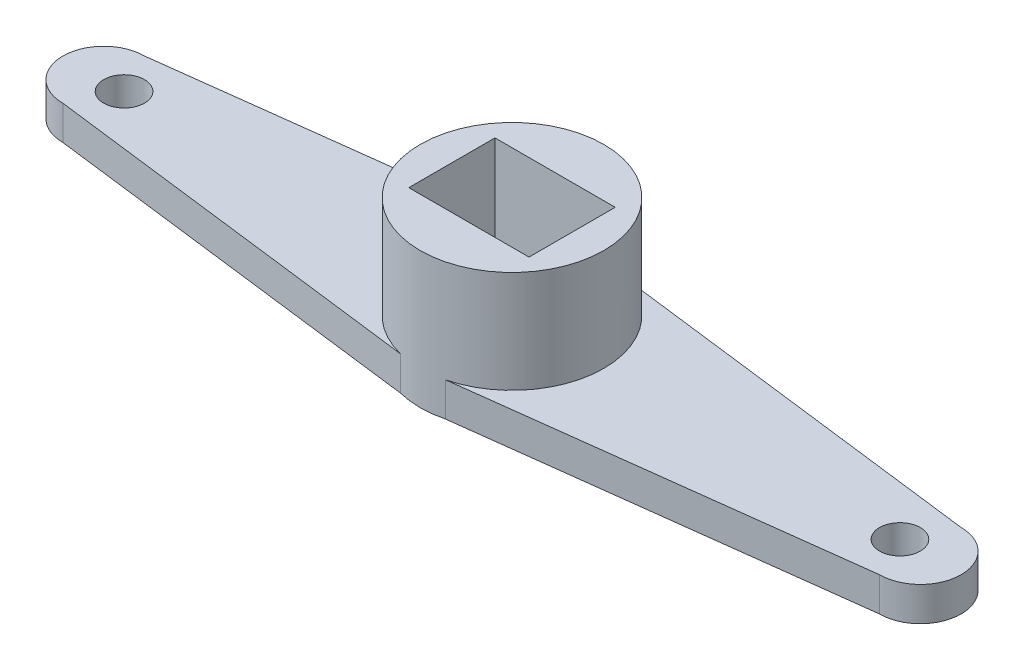
ISO-10303-21;
HEADER;
FILE_DESCRIPTION(('STEP AP214'),'2;1');
FILE_NAME('part.step','',(''),(''),'','','');
FILE_SCHEMA(('AUTOMOTIVE_DESIGN { 1 0 10303 214 1 1 1 1 }'));
ENDSEC;
DATA;
#1=APPLICATION_CONTEXT('core data for automotive mechanical design processes');
#2=APPLICATION_PROTOCOL_DEFINITION('international standard','automotive_design',2000,#1);
#3=PRODUCT_CONTEXT('',#1,'mechanical');
#4=PRODUCT('Part','Part','',(#3));
#5=PRODUCT_RELATED_PRODUCT_CATEGORY('part','',(#4));
#6=PRODUCT_DEFINITION_FORMATION('','',#4);
#7=PRODUCT_DEFINITION_CONTEXT('part definition',#1,'design');
#8=PRODUCT_DEFINITION('design','',#6,#7);
#9=PRODUCT_DEFINITION_SHAPE('','',#8);
#10=(LENGTH_UNIT() NAMED_UNIT(*) SI_UNIT(.MILLI.,.METRE.));
#11=(NAMED_UNIT(*) PLANE_ANGLE_UNIT() SI_UNIT($,.RADIAN.));
#12=(NAMED_UNIT(*) SI_UNIT($,.STERADIAN.) SOLID_ANGLE_UNIT());
#13=UNCERTAINTY_MEASURE_WITH_UNIT(LENGTH_MEASURE(1.E-05),#10,'distance_accuracy_value','');
#14=(GEOMETRIC_REPRESENTATION_CONTEXT(3) GLOBAL_UNCERTAINTY_ASSIGNED_CONTEXT((#13)) GLOBAL_UNIT_ASSIGNED_CONTEXT((#10,
#11,#12)) REPRESENTATION_CONTEXT('',''));
#15=CARTESIAN_POINT('',(0.,0.,0.));
#16=DIRECTION('',(0.,0.,1.));
#17=DIRECTION('',(1.,0.,0.));
#18=AXIS2_PLACEMENT_3D('',#15,#16,#17);
#19=CARTESIAN_POINT('',(0.,0.,0.));
#20=DIRECTION('',(0.,1.,0.));
#21=DIRECTION('',(0.,0.,1.));
#22=AXIS2_PLACEMENT_3D('',#19,#20,#21);
#23=PLANE('',#22);
#24=DIRECTION('',(-0.992277876713668,0.,0.124034734589209));
#25=VECTOR('',#24,1.);
#26=CARTESIAN_POINT('',(-18.,0.,-1.8));
#27=LINE('',#26,#25);
#28=CARTESIAN_POINT('',(-0.996923076923081,0.,-3.92538461538461));
#29=VERTEX_POINT('',#28);
#30=CARTESIAN_POINT('',(-18.,0.,-1.8));
#31=VERTEX_POINT('',#30);
#32=EDGE_CURVE('E178',#29,#31,#27,.T.);
#33=ORIENTED_EDGE('',*,*,#32,.F.);
#34=CARTESIAN_POINT('',(0.,0.,0.));
#35=DIRECTION('',(0.,1.,0.));
#36=DIRECTION('',(0.,0.,1.));
#37=AXIS2_PLACEMENT_3D('',#34,#35,#36);
#38=CIRCLE('',#37,4.05);
#39=CARTESIAN_POINT('',(0.996923076923074,0.,-3.92538461538462));
#40=VERTEX_POINT('',#39);
#41=EDGE_CURVE('E130',#40,#29,#38,.T.);
#42=ORIENTED_EDGE('',*,*,#41,.F.);
#43=DIRECTION('',(-0.992277876713668,0.,-0.124034734589209));
#44=VECTOR('',#43,1.);
#45=CARTESIAN_POINT('',(0.,0.,-4.05));
#46=LINE('',#45,#44);
#47=CARTESIAN_POINT('',(18.,0.,-1.8));
#48=VERTEX_POINT('',#47);
#49=EDGE_CURVE('E175',#48,#40,#46,.T.);
#50=ORIENTED_EDGE('',*,*,#49,.F.);
#51=CARTESIAN_POINT('',(18.,0.,0.));
#52=DIRECTION('',(0.,1.,0.));
#53=DIRECTION('',(0.,0.,-1.));
#54=AXIS2_PLACEMENT_3D('',#51,#52,#53);
#55=CIRCLE('',#54,1.8);
#56=CARTESIAN_POINT('',(18.,0.,1.8));
#57=VERTEX_POINT('',#56);
#58=EDGE_CURVE('E155',#57,#48,#55,.T.);
#59=ORIENTED_EDGE('',*,*,#58,.F.);
#60=DIRECTION('',(0.992277876713668,0.,-0.124034734589209));
#61=VECTOR('',#60,1.);
#62=CARTESIAN_POINT('',(18.,0.,1.8));
#63=LINE('',#62,#61);
#64=CARTESIAN_POINT('',(0.996923076923081,0.,3.92538461538461));
#65=VERTEX_POINT('',#64);
#66=EDGE_CURVE('E160',#65,#57,#63,.T.);
#67=ORIENTED_EDGE('',*,*,#66,.F.);
#68=CARTESIAN_POINT('',(-0.996923076923073,0.,3.92538461538462));
#69=VERTEX_POINT('',#68);
#70=EDGE_CURVE('E217',#69,#65,#38,.T.);
#71=ORIENTED_EDGE('',*,*,#70,.F.);
#72=DIRECTION('',(0.992277876713668,0.,0.124034734589208));
#73=VECTOR('',#72,1.);
#74=CARTESIAN_POINT('',(0.,0.,4.05));
#75=LINE('',#74,#73);
#76=CARTESIAN_POINT('',(-18.,0.,1.8));
#77=VERTEX_POINT('',#76);
#78=EDGE_CURVE('E182',#77,#69,#75,.T.);
#79=ORIENTED_EDGE('',*,*,#78,.F.);
#80=CARTESIAN_POINT('',(-18.,0.,0.));
#81=DIRECTION('',(0.,1.,0.));
#82=DIRECTION('',(0.,0.,1.));
#83=AXIS2_PLACEMENT_3D('',#80,#81,#82);
#84=CIRCLE('',#83,1.8);
#85=EDGE_CURVE('E180',#31,#77,#84,.T.);
#86=ORIENTED_EDGE('',*,*,#85,.F.);
#87=EDGE_LOOP('',(#33,#42,#50,#59,#67,#71,#79,#86));
#88=FACE_BOUND('',#87,.T.);
#89=DIRECTION('',(0.,0.,-1.));
#90=VECTOR('',#89,1.);
#91=CARTESIAN_POINT('',(2.65,0.,1.9));
#92=LINE('',#91,#90);
#93=CARTESIAN_POINT('',(2.65,0.,1.9));
#94=VERTEX_POINT('',#93);
#95=CARTESIAN_POINT('',(2.65,0.,-1.9));
#96=VERTEX_POINT('',#95);
#97=EDGE_CURVE('E124',#94,#96,#92,.T.);
#98=ORIENTED_EDGE('',*,*,#97,.T.);
#99=DIRECTION('',(-1.,0.,0.));
#100=VECTOR('',#99,1.);
#101=CARTESIAN_POINT('',(-2.65,0.,-1.9));
#102=LINE('',#101,#100);
#103=CARTESIAN_POINT('',(-2.65,0.,-1.9));
#104=VERTEX_POINT('',#103);
#105=EDGE_CURVE('E134',#96,#104,#102,.T.);
#106=ORIENTED_EDGE('',*,*,#105,.T.);
#107=DIRECTION('',(0.,0.,1.));
#108=VECTOR('',#107,1.);
#109=CARTESIAN_POINT('',(-2.65,0.,1.9));
#110=LINE('',#109,#108);
#111=CARTESIAN_POINT('',(-2.65,0.,1.9));
#112=VERTEX_POINT('',#111);
#113=EDGE_CURVE('E140',#104,#112,#110,.T.);
#114=ORIENTED_EDGE('',*,*,#113,.T.);
#115=DIRECTION('',(1.,0.,0.));
#116=VECTOR('',#115,1.);
#117=CARTESIAN_POINT('',(-2.65,0.,1.9));
#118=LINE('',#117,#116);
#119=EDGE_CURVE('E143',#112,#94,#118,.T.);
#120=ORIENTED_EDGE('',*,*,#119,.T.);
#121=EDGE_LOOP('',(#98,#106,#114,#120));
#122=FACE_BOUND('',#121,.T.);
#123=CARTESIAN_POINT('',(-17.1,0.,0.));
#124=DIRECTION('',(0.,1.,0.));
#125=DIRECTION('',(0.,0.,1.));
#126=AXIS2_PLACEMENT_3D('',#123,#124,#125);
#127=CIRCLE('',#126,0.9);
#128=CARTESIAN_POINT('',(-17.1,0.,0.900000000000003));
#129=VERTEX_POINT('',#128);
#130=EDGE_CURVE('E147',#129,#129,#127,.T.);
#131=ORIENTED_EDGE('',*,*,#130,.T.);
#132=EDGE_LOOP('',(#131));
#133=FACE_BOUND('',#132,.T.);
#134=CARTESIAN_POINT('',(17.1,0.,0.));
#135=DIRECTION('',(0.,1.,0.));
#136=DIRECTION('',(0.,0.,1.));
#137=AXIS2_PLACEMENT_3D('',#134,#135,#136);
#138=CIRCLE('',#137,0.9);
#139=CARTESIAN_POINT('',(17.1,0.,0.900000000000001));
#140=VERTEX_POINT('',#139);
#141=EDGE_CURVE('E150',#140,#140,#138,.T.);
#142=ORIENTED_EDGE('',*,*,#141,.T.);
#143=EDGE_LOOP('',(#142));
#144=FACE_BOUND('',#143,.T.);
#145=ADVANCED_FACE('F32',(#88,#122,#133,#144),#23,.F.);
#146=CARTESIAN_POINT('',(0.,6.,0.));
#147=DIRECTION('',(0.,-1.,0.));
#148=DIRECTION('',(0.,0.,-1.));
#149=AXIS2_PLACEMENT_3D('',#146,#147,#148);
#150=CYLINDRICAL_SURFACE('',#149,4.05);
#151=CARTESIAN_POINT('',(0.,6.,0.));
#152=DIRECTION('',(0.,1.,0.));
#153=DIRECTION('',(0.,0.,1.));
#154=AXIS2_PLACEMENT_3D('',#151,#152,#153);
#155=CIRCLE('',#154,4.05);
#156=CARTESIAN_POINT('',(0.,6.,4.05));
#157=VERTEX_POINT('',#156);
#158=EDGE_CURVE('E213',#157,#157,#155,.T.);
#159=ORIENTED_EDGE('',*,*,#158,.F.);
#160=EDGE_LOOP('',(#159));
#161=FACE_BOUND('',#160,.T.);
#162=DIRECTION('',(0.,-1.,0.));
#163=VECTOR('',#162,1.);
#164=CARTESIAN_POINT('',(0.996923076923074,6.,-3.92538461538462));
#165=LINE('',#164,#163);
#166=CARTESIAN_POINT('',(0.996923076923074,1.5,-3.92538461538462));
#167=VERTEX_POINT('',#166);
#168=EDGE_CURVE('E11',#40,#167,#165,.F.);
#169=ORIENTED_EDGE('',*,*,#168,.F.);
#170=ORIENTED_EDGE('',*,*,#41,.T.);
#171=DIRECTION('',(0.,-1.,0.));
#172=VECTOR('',#171,1.);
#173=CARTESIAN_POINT('',(-0.996923076923081,6.,-3.92538461538461));
#174=LINE('',#173,#172);
#175=CARTESIAN_POINT('',(-0.996923076923081,1.5,-3.92538461538461));
#176=VERTEX_POINT('',#175);
#177=EDGE_CURVE('E221',#176,#29,#174,.T.);
#178=ORIENTED_EDGE('',*,*,#177,.F.);
#179=CARTESIAN_POINT('',(0.,1.5,0.));
#180=DIRECTION('',(0.,-1.,0.));
#181=DIRECTION('',(0.,0.,-1.));
#182=AXIS2_PLACEMENT_3D('',#179,#180,#181);
#183=CIRCLE('',#182,4.05);
#184=CARTESIAN_POINT('',(-0.996923076923073,1.5,3.92538461538462));
#185=VERTEX_POINT('',#184);
#186=EDGE_CURVE('E197',#185,#176,#183,.T.);
#187=ORIENTED_EDGE('',*,*,#186,.F.);
#188=DIRECTION('',(0.,-1.,0.));
#189=VECTOR('',#188,1.);
#190=CARTESIAN_POINT('',(-0.996923076923073,6.,3.92538461538462));
#191=LINE('',#190,#189);
#192=EDGE_CURVE('E216',#69,#185,#191,.F.);
#193=ORIENTED_EDGE('',*,*,#192,.F.);
#194=ORIENTED_EDGE('',*,*,#70,.T.);
#195=DIRECTION('',(0.,-1.,0.));
#196=VECTOR('',#195,1.);
#197=CARTESIAN_POINT('',(0.996923076923081,6.,3.92538461538461));
#198=LINE('',#197,#196);
#199=CARTESIAN_POINT('',(0.996923076923081,1.5,3.92538461538461));
#200=VERTEX_POINT('',#199);
#201=EDGE_CURVE('E40',#200,#65,#198,.T.);
#202=ORIENTED_EDGE('',*,*,#201,.F.);
#203=EDGE_CURVE('E200',#167,#200,#183,.T.);
#204=ORIENTED_EDGE('',*,*,#203,.F.);
#205=EDGE_LOOP('',(#169,#170,#178,#187,#193,#194,#202,#204));
#206=FACE_BOUND('',#205,.T.);
#207=ADVANCED_FACE('F34',(#161,#206),#150,.T.);
#208=CARTESIAN_POINT('',(2.65,6.,1.9));
#209=DIRECTION('',(-1.,0.,0.));
#210=DIRECTION('',(0.,0.,1.));
#211=AXIS2_PLACEMENT_3D('',#208,#209,#210);
#212=PLANE('',#211);
#213=DIRECTION('',(0.,-1.,0.));
#214=VECTOR('',#213,1.);
#215=CARTESIAN_POINT('',(2.65,6.,-1.9));
#216=LINE('',#215,#214);
#217=CARTESIAN_POINT('',(2.65,6.,-1.9));
#218=VERTEX_POINT('',#217);
#219=EDGE_CURVE('E120',#218,#96,#216,.T.);
#220=ORIENTED_EDGE('',*,*,#219,.T.);
#221=ORIENTED_EDGE('',*,*,#97,.F.);
#222=DIRECTION('',(0.,-1.,0.));
#223=VECTOR('',#222,1.);
#224=CARTESIAN_POINT('',(2.65,6.,1.9));
#225=LINE('',#224,#223);
#226=CARTESIAN_POINT('',(2.65,6.,1.9));
#227=VERTEX_POINT('',#226);
#228=EDGE_CURVE('E47',#227,#94,#225,.T.);
#229=ORIENTED_EDGE('',*,*,#228,.F.);
#230=DIRECTION('',(0.,0.,-1.));
#231=VECTOR('',#230,1.);
#232=CARTESIAN_POINT('',(2.65,6.,1.9));
#233=LINE('',#232,#231);
#234=EDGE_CURVE('E127',#227,#218,#233,.T.);
#235=ORIENTED_EDGE('',*,*,#234,.T.);
#236=EDGE_LOOP('',(#220,#221,#229,#235));
#237=FACE_BOUND('',#236,.T.);
#238=ADVANCED_FACE('F122',(#237),#212,.T.);
#239=CARTESIAN_POINT('',(-2.65,6.,-1.9));
#240=DIRECTION('',(0.,0.,1.));
#241=DIRECTION('',(1.,0.,0.));
#242=AXIS2_PLACEMENT_3D('',#239,#240,#241);
#243=PLANE('',#242);
#244=DIRECTION('',(0.,-1.,0.));
#245=VECTOR('',#244,1.);
#246=CARTESIAN_POINT('',(-2.65,6.,-1.9));
#247=LINE('',#246,#245);
#248=CARTESIAN_POINT('',(-2.65,6.,-1.9));
#249=VERTEX_POINT('',#248);
#250=EDGE_CURVE('E131',#249,#104,#247,.T.);
#251=ORIENTED_EDGE('',*,*,#250,.T.);
#252=ORIENTED_EDGE('',*,*,#105,.F.);
#253=ORIENTED_EDGE('',*,*,#219,.F.);
#254=DIRECTION('',(-1.,0.,0.));
#255=VECTOR('',#254,1.);
#256=CARTESIAN_POINT('',(-2.65,6.,-1.9));
#257=LINE('',#256,#255);
#258=EDGE_CURVE('E202',#218,#249,#257,.T.);
#259=ORIENTED_EDGE('',*,*,#258,.T.);
#260=EDGE_LOOP('',(#251,#252,#253,#259));
#261=FACE_BOUND('',#260,.T.);
#262=ADVANCED_FACE('F135',(#261),#243,.T.);
#263=CARTESIAN_POINT('',(-2.65,6.,1.9));
#264=DIRECTION('',(1.,0.,0.));
#265=DIRECTION('',(0.,0.,-1.));
#266=AXIS2_PLACEMENT_3D('',#263,#264,#265);
#267=PLANE('',#266);
#268=DIRECTION('',(0.,-1.,0.));
#269=VECTOR('',#268,1.);
#270=CARTESIAN_POINT('',(-2.65,6.,1.9));
#271=LINE('',#270,#269);
#272=CARTESIAN_POINT('',(-2.65,6.,1.9));
#273=VERTEX_POINT('',#272);
#274=EDGE_CURVE('E210',#273,#112,#271,.T.);
#275=ORIENTED_EDGE('',*,*,#274,.T.);
#276=ORIENTED_EDGE('',*,*,#113,.F.);
#277=ORIENTED_EDGE('',*,*,#250,.F.);
#278=DIRECTION('',(0.,0.,1.));
#279=VECTOR('',#278,1.);
#280=CARTESIAN_POINT('',(-2.65,6.,1.9));
#281=LINE('',#280,#279);
#282=EDGE_CURVE('E204',#249,#273,#281,.T.);
#283=ORIENTED_EDGE('',*,*,#282,.T.);
#284=EDGE_LOOP('',(#275,#276,#277,#283));
#285=FACE_BOUND('',#284,.T.);
#286=ADVANCED_FACE('F270',(#285),#267,.T.);
#287=CARTESIAN_POINT('',(-2.65,6.,1.9));
#288=DIRECTION('',(0.,0.,-1.));
#289=DIRECTION('',(-1.,0.,0.));
#290=AXIS2_PLACEMENT_3D('',#287,#288,#289);
#291=PLANE('',#290);
#292=ORIENTED_EDGE('',*,*,#228,.T.);
#293=ORIENTED_EDGE('',*,*,#119,.F.);
#294=ORIENTED_EDGE('',*,*,#274,.F.);
#295=DIRECTION('',(1.,0.,0.));
#296=VECTOR('',#295,1.);
#297=CARTESIAN_POINT('',(-2.65,6.,1.9));
#298=LINE('',#297,#296);
#299=EDGE_CURVE('E207',#273,#227,#298,.T.);
#300=ORIENTED_EDGE('',*,*,#299,.T.);
#301=EDGE_LOOP('',(#292,#293,#294,#300));
#302=FACE_BOUND('',#301,.T.);
#303=ADVANCED_FACE('F264',(#302),#291,.T.);
#304=CARTESIAN_POINT('',(0.,6.,0.));
#305=DIRECTION('',(0.,1.,0.));
#306=DIRECTION('',(0.,0.,1.));
#307=AXIS2_PLACEMENT_3D('',#304,#305,#306);
#308=PLANE('',#307);
#309=ORIENTED_EDGE('',*,*,#158,.T.);
#310=EDGE_LOOP('',(#309));
#311=FACE_BOUND('',#310,.T.);
#312=ORIENTED_EDGE('',*,*,#258,.F.);
#313=ORIENTED_EDGE('',*,*,#234,.F.);
#314=ORIENTED_EDGE('',*,*,#299,.F.);
#315=ORIENTED_EDGE('',*,*,#282,.F.);
#316=EDGE_LOOP('',(#312,#313,#314,#315));
#317=FACE_BOUND('',#316,.T.);
#318=ADVANCED_FACE('F260',(#311,#317),#308,.T.);
#319=CARTESIAN_POINT('',(-18.,1.5,0.));
#320=DIRECTION('',(0.,-1.,0.));
#321=DIRECTION('',(0.,0.,-1.));
#322=AXIS2_PLACEMENT_3D('',#319,#320,#321);
#323=CYLINDRICAL_SURFACE('',#322,1.8);
#324=ORIENTED_EDGE('',*,*,#85,.T.);
#325=DIRECTION('',(0.,-1.,0.));
#326=VECTOR('',#325,1.);
#327=CARTESIAN_POINT('',(-18.,1.5,1.8));
#328=LINE('',#327,#326);
#329=CARTESIAN_POINT('',(-18.,1.5,1.8));
#330=VERTEX_POINT('',#329);
#331=EDGE_CURVE('E188',#330,#77,#328,.T.);
#332=ORIENTED_EDGE('',*,*,#331,.F.);
#333=CARTESIAN_POINT('',(-18.,1.5,0.));
#334=DIRECTION('',(0.,1.,0.));
#335=DIRECTION('',(0.,0.,1.));
#336=AXIS2_PLACEMENT_3D('',#333,#334,#335);
#337=CIRCLE('',#336,1.8);
#338=CARTESIAN_POINT('',(-18.,1.5,-1.8));
#339=VERTEX_POINT('',#338);
#340=EDGE_CURVE('E165',#339,#330,#337,.T.);
#341=ORIENTED_EDGE('',*,*,#340,.F.);
#342=DIRECTION('',(0.,-1.,0.));
#343=VECTOR('',#342,1.);
#344=CARTESIAN_POINT('',(-18.,1.5,-1.8));
#345=LINE('',#344,#343);
#346=EDGE_CURVE('E191',#339,#31,#345,.T.);
#347=ORIENTED_EDGE('',*,*,#346,.T.);
#348=EDGE_LOOP('',(#324,#332,#341,#347));
#349=FACE_BOUND('',#348,.T.);
#350=ADVANCED_FACE('F263',(#349),#323,.T.);
#351=CARTESIAN_POINT('',(18.,1.5,0.));
#352=DIRECTION('',(0.,-1.,0.));
#353=DIRECTION('',(0.,0.,-1.));
#354=AXIS2_PLACEMENT_3D('',#351,#352,#353);
#355=PLANE('',#354);
#356=CARTESIAN_POINT('',(-17.1,1.5,0.));
#357=DIRECTION('',(0.,1.,0.));
#358=DIRECTION('',(0.,0.,1.));
#359=AXIS2_PLACEMENT_3D('',#356,#357,#358);
#360=CIRCLE('',#359,0.9);
#361=CARTESIAN_POINT('',(-17.1,1.5,0.900000000000003));
#362=VERTEX_POINT('',#361);
#363=EDGE_CURVE('E144',#362,#362,#360,.T.);
#364=ORIENTED_EDGE('',*,*,#363,.F.);
#365=EDGE_LOOP('',(#364));
#366=FACE_BOUND('',#365,.T.);
#367=DIRECTION('',(0.992277876713668,0.,0.124034734589208));
#368=VECTOR('',#367,1.);
#369=CARTESIAN_POINT('',(0.,1.5,4.05));
#370=LINE('',#369,#368);
#371=EDGE_CURVE('E167',#330,#185,#370,.T.);
#372=ORIENTED_EDGE('',*,*,#371,.T.);
#373=ORIENTED_EDGE('',*,*,#186,.T.);
#374=DIRECTION('',(-0.992277876713668,0.,0.124034734589209));
#375=VECTOR('',#374,1.);
#376=CARTESIAN_POINT('',(-18.,1.5,-1.8));
#377=LINE('',#376,#375);
#378=EDGE_CURVE('E163',#176,#339,#377,.T.);
#379=ORIENTED_EDGE('',*,*,#378,.T.);
#380=ORIENTED_EDGE('',*,*,#340,.T.);
#381=EDGE_LOOP('',(#372,#373,#379,#380));
#382=FACE_BOUND('',#381,.T.);
#383=ADVANCED_FACE('F286',(#366,#382),#355,.F.);
#384=CARTESIAN_POINT('',(0.,1.5,4.05));
#385=DIRECTION('',(0.124034734589208,0.,-0.992277876713668));
#386=DIRECTION('',(-0.992277876713668,0.,-0.124034734589208));
#387=AXIS2_PLACEMENT_3D('',#384,#385,#386);
#388=PLANE('',#387);
#389=ORIENTED_EDGE('',*,*,#78,.T.);
#390=ORIENTED_EDGE('',*,*,#192,.T.);
#391=ORIENTED_EDGE('',*,*,#371,.F.);
#392=ORIENTED_EDGE('',*,*,#331,.T.);
#393=EDGE_LOOP('',(#389,#390,#391,#392));
#394=FACE_BOUND('',#393,.T.);
#395=ADVANCED_FACE('F250',(#394),#388,.F.);
#396=CARTESIAN_POINT('',(-18.,1.5,-1.8));
#397=DIRECTION('',(0.124034734589209,0.,0.992277876713668));
#398=DIRECTION('',(0.992277876713668,0.,-0.124034734589209));
#399=AXIS2_PLACEMENT_3D('',#396,#397,#398);
#400=PLANE('',#399);
#401=ORIENTED_EDGE('',*,*,#378,.F.);
#402=ORIENTED_EDGE('',*,*,#177,.T.);
#403=ORIENTED_EDGE('',*,*,#32,.T.);
#404=ORIENTED_EDGE('',*,*,#346,.F.);
#405=EDGE_LOOP('',(#401,#402,#403,#404));
#406=FACE_BOUND('',#405,.T.);
#407=ADVANCED_FACE('F243',(#406),#400,.F.);
#408=CARTESIAN_POINT('',(0.,1.5,-4.05));
#409=DIRECTION('',(-0.124034734589209,0.,0.992277876713668));
#410=DIRECTION('',(0.992277876713668,0.,0.124034734589209));
#411=AXIS2_PLACEMENT_3D('',#408,#409,#410);
#412=PLANE('',#411);
#413=ORIENTED_EDGE('',*,*,#49,.T.);
#414=ORIENTED_EDGE('',*,*,#168,.T.);
#415=DIRECTION('',(-0.992277876713668,0.,-0.124034734589209));
#416=VECTOR('',#415,1.);
#417=CARTESIAN_POINT('',(0.,1.5,-4.05));
#418=LINE('',#417,#416);
#419=CARTESIAN_POINT('',(18.,1.5,-1.8));
#420=VERTEX_POINT('',#419);
#421=EDGE_CURVE('E159',#420,#167,#418,.T.);
#422=ORIENTED_EDGE('',*,*,#421,.F.);
#423=DIRECTION('',(0.,-1.,0.));
#424=VECTOR('',#423,1.);
#425=CARTESIAN_POINT('',(18.,1.5,-1.8));
#426=LINE('',#425,#424);
#427=EDGE_CURVE('E194',#420,#48,#426,.T.);
#428=ORIENTED_EDGE('',*,*,#427,.T.);
#429=EDGE_LOOP('',(#413,#414,#422,#428));
#430=FACE_BOUND('',#429,.T.);
#431=ADVANCED_FACE('F241',(#430),#412,.F.);
#432=CARTESIAN_POINT('',(18.,1.5,1.8));
#433=DIRECTION('',(-0.124034734589209,0.,-0.992277876713668));
#434=DIRECTION('',(-0.992277876713668,0.,0.124034734589209));
#435=AXIS2_PLACEMENT_3D('',#432,#433,#434);
#436=PLANE('',#435);
#437=DIRECTION('',(0.992277876713668,0.,-0.124034734589209));
#438=VECTOR('',#437,1.);
#439=CARTESIAN_POINT('',(18.,1.5,1.8));
#440=LINE('',#439,#438);
#441=CARTESIAN_POINT('',(18.,1.5,1.8));
#442=VERTEX_POINT('',#441);
#443=EDGE_CURVE('E170',#200,#442,#440,.T.);
#444=ORIENTED_EDGE('',*,*,#443,.F.);
#445=ORIENTED_EDGE('',*,*,#201,.T.);
#446=ORIENTED_EDGE('',*,*,#66,.T.);
#447=DIRECTION('',(0.,-1.,0.));
#448=VECTOR('',#447,1.);
#449=CARTESIAN_POINT('',(18.,1.5,1.8));
#450=LINE('',#449,#448);
#451=EDGE_CURVE('E172',#442,#57,#450,.T.);
#452=ORIENTED_EDGE('',*,*,#451,.F.);
#453=EDGE_LOOP('',(#444,#445,#446,#452));
#454=FACE_BOUND('',#453,.T.);
#455=ADVANCED_FACE('F226',(#454),#436,.F.);
#456=CARTESIAN_POINT('',(17.1,1.5,0.));
#457=DIRECTION('',(0.,1.,0.));
#458=DIRECTION('',(0.,0.,1.));
#459=AXIS2_PLACEMENT_3D('',#456,#457,#458);
#460=CIRCLE('',#459,0.9);
#461=CARTESIAN_POINT('',(17.1,1.5,0.900000000000001));
#462=VERTEX_POINT('',#461);
#463=EDGE_CURVE('E314',#462,#462,#460,.T.);
#464=ORIENTED_EDGE('',*,*,#463,.F.);
#465=EDGE_LOOP('',(#464));
#466=FACE_BOUND('',#465,.T.);
#467=ORIENTED_EDGE('',*,*,#421,.T.);
#468=ORIENTED_EDGE('',*,*,#203,.T.);
#469=ORIENTED_EDGE('',*,*,#443,.T.);
#470=CARTESIAN_POINT('',(18.,1.5,0.));
#471=DIRECTION('',(0.,1.,0.));
#472=DIRECTION('',(0.,0.,-1.));
#473=AXIS2_PLACEMENT_3D('',#470,#471,#472);
#474=CIRCLE('',#473,1.8);
#475=EDGE_CURVE('E156',#442,#420,#474,.T.);
#476=ORIENTED_EDGE('',*,*,#475,.T.);
#477=EDGE_LOOP('',(#467,#468,#469,#476));
#478=FACE_BOUND('',#477,.T.);
#479=ADVANCED_FACE('F238',(#466,#478),#355,.F.);
#480=CARTESIAN_POINT('',(18.,1.5,0.));
#481=DIRECTION('',(0.,-1.,0.));
#482=DIRECTION('',(0.,0.,-1.));
#483=AXIS2_PLACEMENT_3D('',#480,#481,#482);
#484=CYLINDRICAL_SURFACE('',#483,1.8);
#485=ORIENTED_EDGE('',*,*,#58,.T.);
#486=ORIENTED_EDGE('',*,*,#427,.F.);
#487=ORIENTED_EDGE('',*,*,#475,.F.);
#488=ORIENTED_EDGE('',*,*,#451,.T.);
#489=EDGE_LOOP('',(#485,#486,#487,#488));
#490=FACE_BOUND('',#489,.T.);
#491=ADVANCED_FACE('F235',(#490),#484,.T.);
#492=CARTESIAN_POINT('',(17.1,1.5,0.));
#493=DIRECTION('',(0.,-1.,0.));
#494=DIRECTION('',(0.,0.,-1.));
#495=AXIS2_PLACEMENT_3D('',#492,#493,#494);
#496=CYLINDRICAL_SURFACE('',#495,0.9);
#497=ORIENTED_EDGE('',*,*,#463,.T.);
#498=EDGE_LOOP('',(#497));
#499=FACE_BOUND('',#498,.T.);
#500=ORIENTED_EDGE('',*,*,#141,.F.);
#501=EDGE_LOOP('',(#500));
#502=FACE_BOUND('',#501,.T.);
#503=ADVANCED_FACE('F276',(#499,#502),#496,.F.);
#504=CARTESIAN_POINT('',(-17.1,1.5,0.));
#505=DIRECTION('',(0.,-1.,0.));
#506=DIRECTION('',(0.,0.,-1.));
#507=AXIS2_PLACEMENT_3D('',#504,#505,#506);
#508=CYLINDRICAL_SURFACE('',#507,0.9);
#509=ORIENTED_EDGE('',*,*,#363,.T.);
#510=EDGE_LOOP('',(#509));
#511=FACE_BOUND('',#510,.T.);
#512=ORIENTED_EDGE('',*,*,#130,.F.);
#513=EDGE_LOOP('',(#512));
#514=FACE_BOUND('',#513,.T.);
#515=ADVANCED_FACE('F281',(#511,#514),#508,.F.);
#516=CLOSED_SHELL('',(#145,#207,#238,#262,#286,#303,#318,#350,#383,#395,#407,#431,#455,#479,
#491,#503,#515));
#517=MANIFOLD_SOLID_BREP('B2',#516);
#518=ADVANCED_BREP_SHAPE_REPRESENTATION('',(#18,#517),#14);
#519=SHAPE_DEFINITION_REPRESENTATION(#9,#518);
ENDSEC;
END-ISO-10303-21;
